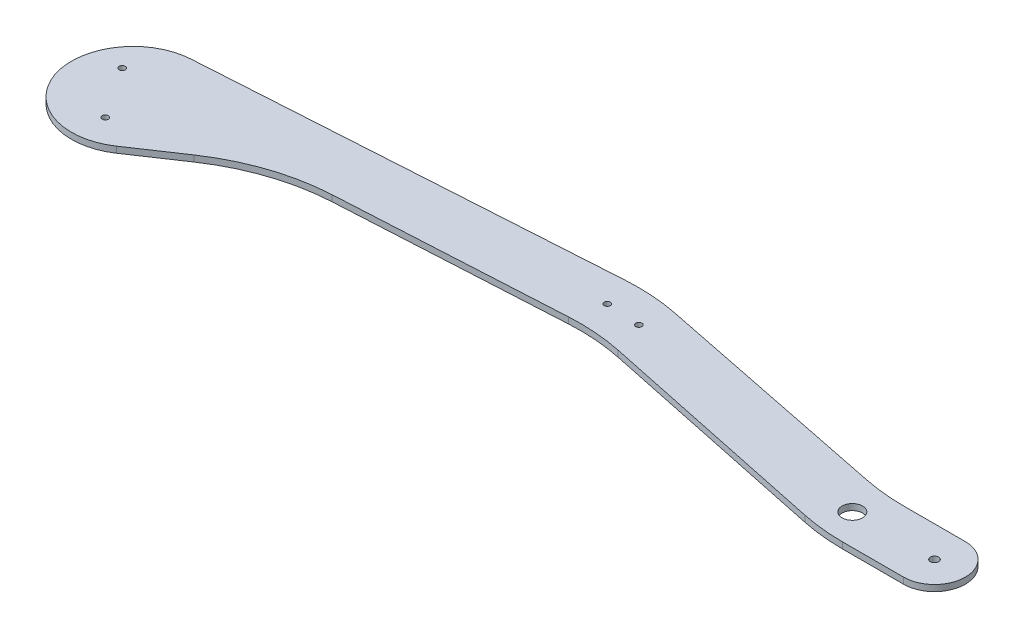
ISO-10303-21;
HEADER;
FILE_DESCRIPTION(('STEP AP214'),'2;1');
FILE_NAME('part.step','',(''),(''),'','','');
FILE_SCHEMA(('AUTOMOTIVE_DESIGN { 1 0 10303 214 1 1 1 1 }'));
ENDSEC;
DATA;
#1=APPLICATION_CONTEXT('core data for automotive mechanical design processes');
#2=APPLICATION_PROTOCOL_DEFINITION('international standard','automotive_design',2000,#1);
#3=PRODUCT_CONTEXT('',#1,'mechanical');
#4=PRODUCT('Part','Part','',(#3));
#5=PRODUCT_RELATED_PRODUCT_CATEGORY('part','',(#4));
#6=PRODUCT_DEFINITION_FORMATION('','',#4);
#7=PRODUCT_DEFINITION_CONTEXT('part definition',#1,'design');
#8=PRODUCT_DEFINITION('design','',#6,#7);
#9=PRODUCT_DEFINITION_SHAPE('','',#8);
#10=(LENGTH_UNIT() NAMED_UNIT(*) SI_UNIT(.MILLI.,.METRE.));
#11=(NAMED_UNIT(*) PLANE_ANGLE_UNIT() SI_UNIT($,.RADIAN.));
#12=(NAMED_UNIT(*) SI_UNIT($,.STERADIAN.) SOLID_ANGLE_UNIT());
#13=UNCERTAINTY_MEASURE_WITH_UNIT(LENGTH_MEASURE(1.E-05),#10,'distance_accuracy_value','');
#14=(GEOMETRIC_REPRESENTATION_CONTEXT(3) GLOBAL_UNCERTAINTY_ASSIGNED_CONTEXT((#13)) GLOBAL_UNIT_ASSIGNED_CONTEXT((#10,
#11,#12)) REPRESENTATION_CONTEXT('',''));
#15=CARTESIAN_POINT('',(0.,0.,0.));
#16=DIRECTION('',(0.,0.,1.));
#17=DIRECTION('',(1.,0.,0.));
#18=AXIS2_PLACEMENT_3D('',#15,#16,#17);
#19=CARTESIAN_POINT('',(-350.,-1.5,0.));
#20=DIRECTION('',(0.,1.,0.));
#21=DIRECTION('',(0.,0.,1.));
#22=AXIS2_PLACEMENT_3D('',#19,#20,#21);
#23=CYLINDRICAL_SURFACE('',#22,30.);
#24=DIRECTION('',(0.,1.,0.));
#25=VECTOR('',#24,1.);
#26=CARTESIAN_POINT('',(-333.28573951652,-1.5,24.9125168638253));
#27=LINE('',#26,#25);
#28=CARTESIAN_POINT('',(-333.28573951652,-1.5,24.9125168638253));
#29=VERTEX_POINT('',#28);
#30=CARTESIAN_POINT('',(-333.28573951652,1.5,24.9125168638253));
#31=VERTEX_POINT('',#30);
#32=EDGE_CURVE('E136',#29,#31,#27,.T.);
#33=ORIENTED_EDGE('',*,*,#32,.T.);
#34=CARTESIAN_POINT('',(-350.,1.5,0.));
#35=DIRECTION('',(0.,1.,0.));
#36=DIRECTION('',(0.,0.,1.));
#37=AXIS2_PLACEMENT_3D('',#34,#35,#36);
#38=CIRCLE('',#37,30.);
#39=CARTESIAN_POINT('',(-351.875417006676,1.5,-29.9413228006224));
#40=VERTEX_POINT('',#39);
#41=EDGE_CURVE('E140',#40,#31,#38,.T.);
#42=ORIENTED_EDGE('',*,*,#41,.F.);
#43=DIRECTION('',(0.,1.,0.));
#44=VECTOR('',#43,1.);
#45=CARTESIAN_POINT('',(-351.875417006676,-1.5,-29.9413228006224));
#46=LINE('',#45,#44);
#47=CARTESIAN_POINT('',(-351.875417006676,-1.5,-29.9413228006224));
#48=VERTEX_POINT('',#47);
#49=EDGE_CURVE('E215',#48,#40,#46,.T.);
#50=ORIENTED_EDGE('',*,*,#49,.F.);
#51=CARTESIAN_POINT('',(-350.,-1.5,0.));
#52=DIRECTION('',(0.,1.,0.));
#53=DIRECTION('',(0.,0.,1.));
#54=AXIS2_PLACEMENT_3D('',#51,#52,#53);
#55=CIRCLE('',#54,30.);
#56=EDGE_CURVE('E142',#48,#29,#55,.T.);
#57=ORIENTED_EDGE('',*,*,#56,.T.);
#58=EDGE_LOOP('',(#33,#42,#50,#57));
#59=FACE_BOUND('',#58,.T.);
#60=ADVANCED_FACE('F35',(#59),#23,.T.);
#61=CARTESIAN_POINT('',(-3.24321270903869,-1.5,-51.778392904997));
#62=DIRECTION('',(-0.0625139002225495,0.,-0.998044093354079));
#63=DIRECTION('',(-0.998044093354079,0.,0.0625139002225496));
#64=AXIS2_PLACEMENT_3D('',#61,#62,#63);
#65=PLANE('',#64);
#66=DIRECTION('',(-0.998044093354079,0.,0.0625139002225495));
#67=VECTOR('',#66,1.);
#68=CARTESIAN_POINT('',(-3.24321270903869,1.5,-51.778392904997));
#69=LINE('',#68,#67);
#70=CARTESIAN_POINT('',(-152.924441108368,1.5,-42.4028979347315));
#71=VERTEX_POINT('',#70);
#72=EDGE_CURVE('E160',#71,#40,#69,.T.);
#73=ORIENTED_EDGE('',*,*,#72,.F.);
#74=DIRECTION('',(0.,1.,0.));
#75=VECTOR('',#74,1.);
#76=CARTESIAN_POINT('',(-152.924441108368,-1.5,-42.4028979347315));
#77=LINE('',#76,#75);
#78=CARTESIAN_POINT('',(-152.924441108368,-1.5,-42.4028979347315));
#79=VERTEX_POINT('',#78);
#80=EDGE_CURVE('E245',#71,#79,#77,.F.);
#81=ORIENTED_EDGE('',*,*,#80,.T.);
#82=DIRECTION('',(-0.998044093354079,0.,0.0625139002225495));
#83=VECTOR('',#82,1.);
#84=CARTESIAN_POINT('',(-3.24321270903869,-1.5,-51.778392904997));
#85=LINE('',#84,#83);
#86=EDGE_CURVE('E208',#79,#48,#85,.T.);
#87=ORIENTED_EDGE('',*,*,#86,.T.);
#88=ORIENTED_EDGE('',*,*,#49,.T.);
#89=EDGE_LOOP('',(#73,#81,#87,#88));
#90=FACE_BOUND('',#89,.T.);
#91=ADVANCED_FACE('F278',(#90),#65,.T.);
#92=CARTESIAN_POINT('',(2.91019905832324,-1.5,-14.4123614952442));
#93=DIRECTION('',(0.197929028485096,0.,-0.980216353507197));
#94=DIRECTION('',(-0.980216353507197,0.,-0.197929028485096));
#95=AXIS2_PLACEMENT_3D('',#92,#93,#94);
#96=PLANE('',#95);
#97=DIRECTION('',(-0.980216353507197,0.,-0.197929028485096));
#98=VECTOR('',#97,1.);
#99=CARTESIAN_POINT('',(2.91019905832324,1.5,-14.4123614952442));
#100=LINE('',#99,#98);
#101=CARTESIAN_POINT('',(-9.79757945192511,1.5,-16.9783646492803));
#102=VERTEX_POINT('',#101);
#103=CARTESIAN_POINT('',(-126.880148237604,1.5,-40.6201239500433));
#104=VERTEX_POINT('',#103);
#105=EDGE_CURVE('E180',#102,#104,#100,.T.);
#106=ORIENTED_EDGE('',*,*,#105,.F.);
#107=DIRECTION('',(0.,1.,0.));
#108=VECTOR('',#107,1.);
#109=CARTESIAN_POINT('',(-9.7975794519251,-1.5,-16.9783646492803));
#110=LINE('',#109,#108);
#111=CARTESIAN_POINT('',(-9.79757945192511,-1.5,-16.9783646492803));
#112=VERTEX_POINT('',#111);
#113=EDGE_CURVE('E243',#102,#112,#110,.F.);
#114=ORIENTED_EDGE('',*,*,#113,.T.);
#115=DIRECTION('',(-0.980216353507197,0.,-0.197929028485096));
#116=VECTOR('',#115,1.);
#117=CARTESIAN_POINT('',(2.91019905832324,-1.5,-14.4123614952442));
#118=LINE('',#117,#116);
#119=CARTESIAN_POINT('',(-126.880148237604,-1.5,-40.6201239500433));
#120=VERTEX_POINT('',#119);
#121=EDGE_CURVE('E205',#112,#120,#118,.T.);
#122=ORIENTED_EDGE('',*,*,#121,.T.);
#123=DIRECTION('',(0.,1.,0.));
#124=VECTOR('',#123,1.);
#125=CARTESIAN_POINT('',(-126.880148237604,-1.5,-40.6201239500433));
#126=LINE('',#125,#124);
#127=EDGE_CURVE('E240',#120,#104,#126,.T.);
#128=ORIENTED_EDGE('',*,*,#127,.T.);
#129=EDGE_LOOP('',(#106,#114,#122,#128));
#130=FACE_BOUND('',#129,.T.);
#131=ADVANCED_FACE('F283',(#130),#96,.T.);
#132=CARTESIAN_POINT('',(0.,-1.5,-15.));
#133=DIRECTION('',(0.,0.,1.));
#134=DIRECTION('',(1.,0.,0.));
#135=AXIS2_PLACEMENT_3D('',#132,#133,#134);
#136=PLANE('',#135);
#137=DIRECTION('',(1.,0.,0.));
#138=VECTOR('',#137,1.);
#139=CARTESIAN_POINT('',(0.,-1.5,-15.));
#140=LINE('',#139,#138);
#141=CARTESIAN_POINT('',(9.99532339658448,-1.5,-15.));
#142=VERTEX_POINT('',#141);
#143=CARTESIAN_POINT('',(40.,-1.5,-15.));
#144=VERTEX_POINT('',#143);
#145=EDGE_CURVE('E203',#142,#144,#140,.T.);
#146=ORIENTED_EDGE('',*,*,#145,.F.);
#147=DIRECTION('',(0.,1.,0.));
#148=VECTOR('',#147,1.);
#149=CARTESIAN_POINT('',(9.99532339658448,-1.5,-15.));
#150=LINE('',#149,#148);
#151=CARTESIAN_POINT('',(9.99532339658448,1.5,-15.));
#152=VERTEX_POINT('',#151);
#153=EDGE_CURVE('E237',#142,#152,#150,.T.);
#154=ORIENTED_EDGE('',*,*,#153,.T.);
#155=DIRECTION('',(1.,0.,0.));
#156=VECTOR('',#155,1.);
#157=CARTESIAN_POINT('',(0.,1.5,-15.));
#158=LINE('',#157,#156);
#159=CARTESIAN_POINT('',(40.,1.5,-15.));
#160=VERTEX_POINT('',#159);
#161=EDGE_CURVE('E178',#152,#160,#158,.T.);
#162=ORIENTED_EDGE('',*,*,#161,.T.);
#163=DIRECTION('',(0.,1.,0.));
#164=VECTOR('',#163,1.);
#165=CARTESIAN_POINT('',(40.,-1.5,-15.));
#166=LINE('',#165,#164);
#167=EDGE_CURVE('E218',#144,#160,#166,.T.);
#168=ORIENTED_EDGE('',*,*,#167,.F.);
#169=EDGE_LOOP('',(#146,#154,#162,#168));
#170=FACE_BOUND('',#169,.T.);
#171=ADVANCED_FACE('F318',(#170),#136,.F.);
#172=CARTESIAN_POINT('',(40.,-1.5,0.));
#173=DIRECTION('',(0.,1.,0.));
#174=DIRECTION('',(0.,0.,1.));
#175=AXIS2_PLACEMENT_3D('',#172,#173,#174);
#176=CYLINDRICAL_SURFACE('',#175,15.);
#177=ORIENTED_EDGE('',*,*,#167,.T.);
#178=CARTESIAN_POINT('',(40.,1.5,0.));
#179=DIRECTION('',(0.,1.,0.));
#180=DIRECTION('',(0.,0.,1.));
#181=AXIS2_PLACEMENT_3D('',#178,#179,#180);
#182=CIRCLE('',#181,15.);
#183=CARTESIAN_POINT('',(40.,1.5,15.));
#184=VERTEX_POINT('',#183);
#185=EDGE_CURVE('E175',#184,#160,#182,.T.);
#186=ORIENTED_EDGE('',*,*,#185,.F.);
#187=DIRECTION('',(0.,1.,0.));
#188=VECTOR('',#187,1.);
#189=CARTESIAN_POINT('',(40.,-1.5,15.));
#190=LINE('',#189,#188);
#191=CARTESIAN_POINT('',(40.,-1.5,15.));
#192=VERTEX_POINT('',#191);
#193=EDGE_CURVE('E144',#192,#184,#190,.T.);
#194=ORIENTED_EDGE('',*,*,#193,.F.);
#195=CARTESIAN_POINT('',(40.,-1.5,0.));
#196=DIRECTION('',(0.,1.,0.));
#197=DIRECTION('',(0.,0.,1.));
#198=AXIS2_PLACEMENT_3D('',#195,#196,#197);
#199=CIRCLE('',#198,15.);
#200=EDGE_CURVE('E200',#192,#144,#199,.T.);
#201=ORIENTED_EDGE('',*,*,#200,.T.);
#202=EDGE_LOOP('',(#177,#186,#194,#201));
#203=FACE_BOUND('',#202,.T.);
#204=ADVANCED_FACE('F323',(#203),#176,.T.);
#205=CARTESIAN_POINT('',(0.,-1.5,15.));
#206=DIRECTION('',(0.,0.,1.));
#207=DIRECTION('',(1.,0.,0.));
#208=AXIS2_PLACEMENT_3D('',#205,#206,#207);
#209=PLANE('',#208);
#210=DIRECTION('',(1.,0.,0.));
#211=VECTOR('',#210,1.);
#212=CARTESIAN_POINT('',(0.,1.5,15.));
#213=LINE('',#212,#211);
#214=CARTESIAN_POINT('',(10.2526447189393,1.5,15.));
#215=VERTEX_POINT('',#214);
#216=EDGE_CURVE('E173',#215,#184,#213,.T.);
#217=ORIENTED_EDGE('',*,*,#216,.F.);
#218=DIRECTION('',(0.,1.,0.));
#219=VECTOR('',#218,1.);
#220=CARTESIAN_POINT('',(10.2526447189393,-1.5,15.));
#221=LINE('',#220,#219);
#222=CARTESIAN_POINT('',(10.2526447189393,-1.5,15.));
#223=VERTEX_POINT('',#222);
#224=EDGE_CURVE('E231',#215,#223,#221,.F.);
#225=ORIENTED_EDGE('',*,*,#224,.T.);
#226=DIRECTION('',(1.,0.,0.));
#227=VECTOR('',#226,1.);
#228=CARTESIAN_POINT('',(0.,-1.5,15.));
#229=LINE('',#228,#227);
#230=EDGE_CURVE('E198',#223,#192,#229,.T.);
#231=ORIENTED_EDGE('',*,*,#230,.T.);
#232=ORIENTED_EDGE('',*,*,#193,.T.);
#233=EDGE_LOOP('',(#217,#225,#231,#232));
#234=FACE_BOUND('',#233,.T.);
#235=ADVANCED_FACE('F333',(#234),#209,.T.);
#236=CARTESIAN_POINT('',(-3.01378585704881,-1.5,14.3910568491865));
#237=DIRECTION('',(-0.20497419413347,0.,0.978767377745772));
#238=DIRECTION('',(0.978767377745772,0.,0.20497419413347));
#239=AXIS2_PLACEMENT_3D('',#236,#237,#238);
#240=PLANE('',#239);
#241=DIRECTION('',(0.978767377745772,0.,0.20497419413347));
#242=VECTOR('',#241,1.);
#243=CARTESIAN_POINT('',(-3.01378585704881,-1.5,14.3910568491865));
#244=LINE('',#243,#242);
#245=CARTESIAN_POINT('',(-125.16756201185,-1.5,-11.1904780456087));
#246=VERTEX_POINT('',#245);
#247=CARTESIAN_POINT('',(-10.2447746944077,-1.5,12.8767377745772));
#248=VERTEX_POINT('',#247);
#249=EDGE_CURVE('E195',#246,#248,#244,.T.);
#250=ORIENTED_EDGE('',*,*,#249,.T.);
#251=DIRECTION('',(0.,1.,0.));
#252=VECTOR('',#251,1.);
#253=CARTESIAN_POINT('',(-10.2447746944077,-1.5,12.8767377745772));
#254=LINE('',#253,#252);
#255=CARTESIAN_POINT('',(-10.2447746944077,1.5,12.8767377745772));
#256=VERTEX_POINT('',#255);
#257=EDGE_CURVE('E224',#248,#256,#254,.T.);
#258=ORIENTED_EDGE('',*,*,#257,.T.);
#259=DIRECTION('',(0.978767377745772,0.,0.20497419413347));
#260=VECTOR('',#259,1.);
#261=CARTESIAN_POINT('',(-3.01378585704881,1.5,14.3910568491865));
#262=LINE('',#261,#260);
#263=CARTESIAN_POINT('',(-125.16756201185,1.5,-11.1904780456087));
#264=VERTEX_POINT('',#263);
#265=EDGE_CURVE('E171',#264,#256,#262,.T.);
#266=ORIENTED_EDGE('',*,*,#265,.F.);
#267=DIRECTION('',(0.,1.,0.));
#268=VECTOR('',#267,1.);
#269=CARTESIAN_POINT('',(-125.16756201185,-1.5,-11.1904780456087));
#270=LINE('',#269,#268);
#271=EDGE_CURVE('E217',#264,#246,#270,.F.);
#272=ORIENTED_EDGE('',*,*,#271,.T.);
#273=EDGE_LOOP('',(#250,#258,#266,#272));
#274=FACE_BOUND('',#273,.T.);
#275=ADVANCED_FACE('F330',(#274),#240,.T.);
#276=CARTESIAN_POINT('',(-1.19004921764275,-1.5,-21.4737935567704));
#277=DIRECTION('',(0.0553337702493512,0.,0.998467913290153));
#278=DIRECTION('',(0.998467913290153,0.,-0.0553337702493512));
#279=AXIS2_PLACEMENT_3D('',#276,#277,#278);
#280=PLANE('',#279);
#281=DIRECTION('',(0.998467913290153,0.,-0.0553337702493512));
#282=VECTOR('',#281,1.);
#283=CARTESIAN_POINT('',(-1.19004921764275,-1.5,-21.4737935567704));
#284=LINE('',#283,#282);
#285=CARTESIAN_POINT('',(-260.427572141376,-1.5,-7.1071931457422));
#286=VERTEX_POINT('',#285);
#287=CARTESIAN_POINT('',(-151.198358450132,-1.5,-13.1605316000468));
#288=VERTEX_POINT('',#287);
#289=EDGE_CURVE('E193',#286,#288,#284,.T.);
#290=ORIENTED_EDGE('',*,*,#289,.T.);
#291=DIRECTION('',(0.,1.,0.));
#292=VECTOR('',#291,1.);
#293=CARTESIAN_POINT('',(-151.198358450132,1.5,-13.1605316000468));
#294=LINE('',#293,#292);
#295=CARTESIAN_POINT('',(-151.198358450132,1.5,-13.1605316000468));
#296=VERTEX_POINT('',#295);
#297=EDGE_CURVE('E249',#288,#296,#294,.T.);
#298=ORIENTED_EDGE('',*,*,#297,.T.);
#299=DIRECTION('',(0.998467913290153,0.,-0.0553337702493512));
#300=VECTOR('',#299,1.);
#301=CARTESIAN_POINT('',(-1.19004921764275,1.5,-21.4737935567704));
#302=LINE('',#301,#300);
#303=CARTESIAN_POINT('',(-260.427572141376,1.5,-7.1071931457422));
#304=VERTEX_POINT('',#303);
#305=EDGE_CURVE('E154',#304,#296,#302,.T.);
#306=ORIENTED_EDGE('',*,*,#305,.F.);
#307=DIRECTION('',(0.,1.,0.));
#308=VECTOR('',#307,1.);
#309=CARTESIAN_POINT('',(-260.427572141376,-1.5,-7.10719314574221));
#310=LINE('',#309,#308);
#311=EDGE_CURVE('E247',#304,#286,#310,.F.);
#312=ORIENTED_EDGE('',*,*,#311,.T.);
#313=EDGE_LOOP('',(#290,#298,#306,#312));
#314=FACE_BOUND('',#313,.T.);
#315=ADVANCED_FACE('F263',(#314),#280,.T.);
#316=CARTESIAN_POINT('',(0.,-1.5,0.));
#317=DIRECTION('',(0.,1.,0.));
#318=DIRECTION('',(0.,0.,1.));
#319=AXIS2_PLACEMENT_3D('',#316,#317,#318);
#320=CYLINDRICAL_SURFACE('',#319,5.);
#321=CARTESIAN_POINT('',(0.,-1.5,0.));
#322=DIRECTION('',(0.,1.,0.));
#323=DIRECTION('',(0.,0.,1.));
#324=AXIS2_PLACEMENT_3D('',#321,#322,#323);
#325=CIRCLE('',#324,5.);
#326=CARTESIAN_POINT('',(0.,-1.5,5.));
#327=VERTEX_POINT('',#326);
#328=EDGE_CURVE('E210',#327,#327,#325,.T.);
#329=ORIENTED_EDGE('',*,*,#328,.F.);
#330=EDGE_LOOP('',(#329));
#331=FACE_BOUND('',#330,.T.);
#332=CARTESIAN_POINT('',(0.,1.5,0.));
#333=DIRECTION('',(0.,1.,0.));
#334=DIRECTION('',(0.,0.,1.));
#335=AXIS2_PLACEMENT_3D('',#332,#333,#334);
#336=CIRCLE('',#335,5.);
#337=CARTESIAN_POINT('',(0.,1.5,5.));
#338=VERTEX_POINT('',#337);
#339=EDGE_CURVE('E184',#338,#338,#336,.T.);
#340=ORIENTED_EDGE('',*,*,#339,.T.);
#341=EDGE_LOOP('',(#340));
#342=FACE_BOUND('',#341,.T.);
#343=ADVANCED_FACE('F344',(#331,#342),#320,.F.);
#344=CARTESIAN_POINT('',(-91.9282686591511,-1.5,-137.018598309922));
#345=DIRECTION('',(0.557142016116002,0.,0.830417228794174));
#346=DIRECTION('',(0.830417228794175,0.,-0.557142016116002));
#347=AXIS2_PLACEMENT_3D('',#344,#345,#346);
#348=PLANE('',#347);
#349=DIRECTION('',(0.830417228794175,0.,-0.557142016116002));
#350=VECTOR('',#349,1.);
#351=CARTESIAN_POINT('',(-91.9282686591511,-1.5,-137.018598309922));
#352=LINE('',#351,#350);
#353=CARTESIAN_POINT('',(-310.608396728041,-1.5,9.69787530385566));
#354=VERTEX_POINT('',#353);
#355=EDGE_CURVE('E191',#29,#354,#352,.T.);
#356=ORIENTED_EDGE('',*,*,#355,.T.);
#357=DIRECTION('',(0.,1.,0.));
#358=VECTOR('',#357,1.);
#359=CARTESIAN_POINT('',(-310.608396728041,1.5,9.69787530385566));
#360=LINE('',#359,#358);
#361=CARTESIAN_POINT('',(-310.608396728041,1.5,9.69787530385566));
#362=VERTEX_POINT('',#361);
#363=EDGE_CURVE('E152',#354,#362,#360,.T.);
#364=ORIENTED_EDGE('',*,*,#363,.T.);
#365=DIRECTION('',(0.830417228794175,0.,-0.557142016116002));
#366=VECTOR('',#365,1.);
#367=CARTESIAN_POINT('',(-91.9282686591511,1.5,-137.018598309922));
#368=LINE('',#367,#366);
#369=EDGE_CURVE('E149',#31,#362,#368,.T.);
#370=ORIENTED_EDGE('',*,*,#369,.F.);
#371=ORIENTED_EDGE('',*,*,#32,.F.);
#372=EDGE_LOOP('',(#356,#364,#370,#371));
#373=FACE_BOUND('',#372,.T.);
#374=ADVANCED_FACE('F150',(#373),#348,.T.);
#375=CARTESIAN_POINT('',(40.,-1.5,0.));
#376=DIRECTION('',(0.,1.,0.));
#377=DIRECTION('',(0.,0.,1.));
#378=AXIS2_PLACEMENT_3D('',#375,#376,#377);
#379=CYLINDRICAL_SURFACE('',#378,2.);
#380=CARTESIAN_POINT('',(40.,-1.5,0.));
#381=DIRECTION('',(0.,1.,0.));
#382=DIRECTION('',(0.,0.,1.));
#383=AXIS2_PLACEMENT_3D('',#380,#381,#382);
#384=CIRCLE('',#383,2.);
#385=CARTESIAN_POINT('',(40.,-1.5,2.));
#386=VERTEX_POINT('',#385);
#387=EDGE_CURVE('E145',#386,#386,#384,.T.);
#388=ORIENTED_EDGE('',*,*,#387,.F.);
#389=EDGE_LOOP('',(#388));
#390=FACE_BOUND('',#389,.T.);
#391=CARTESIAN_POINT('',(40.,1.5,0.));
#392=DIRECTION('',(0.,1.,0.));
#393=DIRECTION('',(0.,0.,1.));
#394=AXIS2_PLACEMENT_3D('',#391,#392,#393);
#395=CIRCLE('',#394,2.);
#396=CARTESIAN_POINT('',(40.,1.5,2.));
#397=VERTEX_POINT('',#396);
#398=EDGE_CURVE('E187',#397,#397,#395,.T.);
#399=ORIENTED_EDGE('',*,*,#398,.T.);
#400=EDGE_LOOP('',(#399));
#401=FACE_BOUND('',#400,.T.);
#402=ADVANCED_FACE('F353',(#390,#401),#379,.F.);
#403=CARTESIAN_POINT('',(0.,-1.5,0.));
#404=DIRECTION('',(0.,1.,0.));
#405=DIRECTION('',(0.,0.,1.));
#406=AXIS2_PLACEMENT_3D('',#403,#404,#405);
#407=PLANE('',#406);
#408=CARTESIAN_POINT('',(-348.032450788802,-1.5,15.4967432247671));
#409=DIRECTION('',(0.,1.,0.));
#410=DIRECTION('',(0.,0.,1.));
#411=AXIS2_PLACEMENT_3D('',#408,#409,#410);
#412=CIRCLE('',#411,1.50000000000002);
#413=CARTESIAN_POINT('',(-348.032450788802,-1.5,16.9967432247671));
#414=VERTEX_POINT('',#413);
#415=EDGE_CURVE('E162',#414,#414,#412,.T.);
#416=ORIENTED_EDGE('',*,*,#415,.T.);
#417=EDGE_LOOP('',(#416));
#418=FACE_BOUND('',#417,.T.);
#419=CARTESIAN_POINT('',(-364.746711272282,-1.5,-9.41577363905814));
#420=DIRECTION('',(0.,1.,0.));
#421=DIRECTION('',(0.,0.,1.));
#422=AXIS2_PLACEMENT_3D('',#419,#420,#421);
#423=CIRCLE('',#422,1.50000000000002);
#424=CARTESIAN_POINT('',(-364.746711272282,-1.5,-7.91577363905811));
#425=VERTEX_POINT('',#424);
#426=EDGE_CURVE('E165',#425,#425,#423,.T.);
#427=ORIENTED_EDGE('',*,*,#426,.T.);
#428=EDGE_LOOP('',(#427));
#429=FACE_BOUND('',#428,.T.);
#430=CARTESIAN_POINT('',(-130.791911052962,-1.5,-26.905656844259));
#431=DIRECTION('',(0.,1.,0.));
#432=DIRECTION('',(0.,0.,1.));
#433=AXIS2_PLACEMENT_3D('',#430,#431,#432);
#434=CIRCLE('',#433,1.50000000000002);
#435=CARTESIAN_POINT('',(-130.791911052962,-1.5,-25.4056568442589));
#436=VERTEX_POINT('',#435);
#437=EDGE_CURVE('E498',#436,#436,#434,.T.);
#438=ORIENTED_EDGE('',*,*,#437,.T.);
#439=EDGE_LOOP('',(#438));
#440=FACE_BOUND('',#439,.T.);
#441=CARTESIAN_POINT('',(-147.33624692302,-1.5,-28.0506034789789));
#442=DIRECTION('',(0.,1.,0.));
#443=DIRECTION('',(0.,0.,1.));
#444=AXIS2_PLACEMENT_3D('',#441,#442,#443);
#445=CIRCLE('',#444,1.5);
#446=CARTESIAN_POINT('',(-147.33624692302,-1.5,-26.5506034789789));
#447=VERTEX_POINT('',#446);
#448=EDGE_CURVE('E501',#447,#447,#445,.T.);
#449=ORIENTED_EDGE('',*,*,#448,.T.);
#450=EDGE_LOOP('',(#449));
#451=FACE_BOUND('',#450,.T.);
#452=ORIENTED_EDGE('',*,*,#230,.F.);
#453=CARTESIAN_POINT('',(10.2526447189393,-1.5,-85.));
#454=DIRECTION('',(0.,1.,0.));
#455=DIRECTION('',(0.,0.,1.));
#456=AXIS2_PLACEMENT_3D('',#453,#454,#455);
#457=CIRCLE('',#456,100.);
#458=EDGE_CURVE('E235',#223,#248,#457,.F.);
#459=ORIENTED_EDGE('',*,*,#458,.T.);
#460=ORIENTED_EDGE('',*,*,#249,.F.);
#461=CARTESIAN_POINT('',(-145.664981425197,-1.5,86.6862597289684));
#462=DIRECTION('',(0.,1.,0.));
#463=DIRECTION('',(0.,0.,1.));
#464=AXIS2_PLACEMENT_3D('',#461,#462,#463);
#465=CIRCLE('',#464,100.);
#466=EDGE_CURVE('E54',#246,#288,#465,.T.);
#467=ORIENTED_EDGE('',*,*,#466,.T.);
#468=ORIENTED_EDGE('',*,*,#289,.F.);
#469=CARTESIAN_POINT('',(-254.894195116441,-1.5,92.7395981832731));
#470=DIRECTION('',(0.,1.,0.));
#471=DIRECTION('',(0.,0.,1.));
#472=AXIS2_PLACEMENT_3D('',#469,#470,#471);
#473=CIRCLE('',#472,100.);
#474=EDGE_CURVE('E11',#286,#354,#473,.T.);
#475=ORIENTED_EDGE('',*,*,#474,.T.);
#476=ORIENTED_EDGE('',*,*,#355,.F.);
#477=ORIENTED_EDGE('',*,*,#56,.F.);
#478=ORIENTED_EDGE('',*,*,#86,.F.);
#479=CARTESIAN_POINT('',(-146.673051086113,-1.5,57.4015114006764));
#480=DIRECTION('',(0.,1.,0.));
#481=DIRECTION('',(0.,0.,1.));
#482=AXIS2_PLACEMENT_3D('',#479,#480,#481);
#483=CIRCLE('',#482,100.);
#484=EDGE_CURVE('E233',#79,#120,#483,.F.);
#485=ORIENTED_EDGE('',*,*,#484,.T.);
#486=ORIENTED_EDGE('',*,*,#121,.F.);
#487=CARTESIAN_POINT('',(9.99532339658448,-1.5,-115.));
#488=DIRECTION('',(0.,1.,0.));
#489=DIRECTION('',(0.,0.,1.));
#490=AXIS2_PLACEMENT_3D('',#487,#488,#489);
#491=CIRCLE('',#490,100.);
#492=EDGE_CURVE('E255',#112,#142,#491,.T.);
#493=ORIENTED_EDGE('',*,*,#492,.T.);
#494=ORIENTED_EDGE('',*,*,#145,.T.);
#495=ORIENTED_EDGE('',*,*,#200,.F.);
#496=EDGE_LOOP('',(#452,#459,#460,#467,#468,#475,#476,#477,#478,#485,#486,#493,#494,#495));
#497=FACE_BOUND('',#496,.T.);
#498=ORIENTED_EDGE('',*,*,#328,.T.);
#499=EDGE_LOOP('',(#498));
#500=FACE_BOUND('',#499,.T.);
#501=ORIENTED_EDGE('',*,*,#387,.T.);
#502=EDGE_LOOP('',(#501));
#503=FACE_BOUND('',#502,.T.);
#504=ADVANCED_FACE('F307',(#418,#429,#440,#451,#497,#500,#503),#407,.F.);
#505=CARTESIAN_POINT('',(0.,1.5,0.));
#506=DIRECTION('',(0.,1.,0.));
#507=DIRECTION('',(0.,0.,1.));
#508=AXIS2_PLACEMENT_3D('',#505,#506,#507);
#509=PLANE('',#508);
#510=CARTESIAN_POINT('',(-348.032450788802,1.5,15.4967432247671));
#511=DIRECTION('',(0.,1.,0.));
#512=DIRECTION('',(0.,0.,1.));
#513=AXIS2_PLACEMENT_3D('',#510,#511,#512);
#514=CIRCLE('',#513,1.50000000000002);
#515=CARTESIAN_POINT('',(-348.032450788802,1.5,16.9967432247671));
#516=VERTEX_POINT('',#515);
#517=EDGE_CURVE('E489',#516,#516,#514,.T.);
#518=ORIENTED_EDGE('',*,*,#517,.F.);
#519=EDGE_LOOP('',(#518));
#520=FACE_BOUND('',#519,.T.);
#521=CARTESIAN_POINT('',(-364.746711272282,1.5,-9.41577363905814));
#522=DIRECTION('',(0.,1.,0.));
#523=DIRECTION('',(0.,0.,1.));
#524=AXIS2_PLACEMENT_3D('',#521,#522,#523);
#525=CIRCLE('',#524,1.50000000000002);
#526=CARTESIAN_POINT('',(-364.746711272282,1.5,-7.91577363905811));
#527=VERTEX_POINT('',#526);
#528=EDGE_CURVE('E511',#527,#527,#525,.T.);
#529=ORIENTED_EDGE('',*,*,#528,.F.);
#530=EDGE_LOOP('',(#529));
#531=FACE_BOUND('',#530,.T.);
#532=CARTESIAN_POINT('',(-130.791911052962,1.5,-26.905656844259));
#533=DIRECTION('',(0.,1.,0.));
#534=DIRECTION('',(0.,0.,1.));
#535=AXIS2_PLACEMENT_3D('',#532,#533,#534);
#536=CIRCLE('',#535,1.50000000000002);
#537=CARTESIAN_POINT('',(-130.791911052962,1.5,-25.4056568442589));
#538=VERTEX_POINT('',#537);
#539=EDGE_CURVE('E507',#538,#538,#536,.T.);
#540=ORIENTED_EDGE('',*,*,#539,.F.);
#541=EDGE_LOOP('',(#540));
#542=FACE_BOUND('',#541,.T.);
#543=CARTESIAN_POINT('',(-147.33624692302,1.5,-28.0506034789789));
#544=DIRECTION('',(0.,1.,0.));
#545=DIRECTION('',(0.,0.,1.));
#546=AXIS2_PLACEMENT_3D('',#543,#544,#545);
#547=CIRCLE('',#546,1.5);
#548=CARTESIAN_POINT('',(-147.33624692302,1.5,-26.5506034789789));
#549=VERTEX_POINT('',#548);
#550=EDGE_CURVE('E503',#549,#549,#547,.T.);
#551=ORIENTED_EDGE('',*,*,#550,.F.);
#552=EDGE_LOOP('',(#551));
#553=FACE_BOUND('',#552,.T.);
#554=ORIENTED_EDGE('',*,*,#265,.T.);
#555=CARTESIAN_POINT('',(10.2526447189393,1.5,-85.));
#556=DIRECTION('',(0.,1.,0.));
#557=DIRECTION('',(0.,0.,1.));
#558=AXIS2_PLACEMENT_3D('',#555,#556,#557);
#559=CIRCLE('',#558,100.);
#560=EDGE_CURVE('E229',#256,#215,#559,.T.);
#561=ORIENTED_EDGE('',*,*,#560,.T.);
#562=ORIENTED_EDGE('',*,*,#216,.T.);
#563=ORIENTED_EDGE('',*,*,#185,.T.);
#564=ORIENTED_EDGE('',*,*,#161,.F.);
#565=CARTESIAN_POINT('',(9.99532339658448,1.5,-115.));
#566=DIRECTION('',(0.,1.,0.));
#567=DIRECTION('',(0.,0.,1.));
#568=AXIS2_PLACEMENT_3D('',#565,#566,#567);
#569=CIRCLE('',#568,100.);
#570=EDGE_CURVE('E253',#152,#102,#569,.F.);
#571=ORIENTED_EDGE('',*,*,#570,.T.);
#572=ORIENTED_EDGE('',*,*,#105,.T.);
#573=CARTESIAN_POINT('',(-146.673051086113,1.5,57.4015114006764));
#574=DIRECTION('',(0.,1.,0.));
#575=DIRECTION('',(0.,0.,1.));
#576=AXIS2_PLACEMENT_3D('',#573,#574,#575);
#577=CIRCLE('',#576,100.);
#578=EDGE_CURVE('E227',#104,#71,#577,.T.);
#579=ORIENTED_EDGE('',*,*,#578,.T.);
#580=ORIENTED_EDGE('',*,*,#72,.T.);
#581=ORIENTED_EDGE('',*,*,#41,.T.);
#582=ORIENTED_EDGE('',*,*,#369,.T.);
#583=CARTESIAN_POINT('',(-254.894195116441,1.5,92.7395981832731));
#584=DIRECTION('',(0.,1.,0.));
#585=DIRECTION('',(0.,0.,1.));
#586=AXIS2_PLACEMENT_3D('',#583,#584,#585);
#587=CIRCLE('',#586,100.);
#588=EDGE_CURVE('E43',#362,#304,#587,.F.);
#589=ORIENTED_EDGE('',*,*,#588,.T.);
#590=ORIENTED_EDGE('',*,*,#305,.T.);
#591=CARTESIAN_POINT('',(-145.664981425197,1.5,86.6862597289684));
#592=DIRECTION('',(0.,1.,0.));
#593=DIRECTION('',(0.,0.,1.));
#594=AXIS2_PLACEMENT_3D('',#591,#592,#593);
#595=CIRCLE('',#594,100.);
#596=EDGE_CURVE('E257',#296,#264,#595,.F.);
#597=ORIENTED_EDGE('',*,*,#596,.T.);
#598=EDGE_LOOP('',(#554,#561,#562,#563,#564,#571,#572,#579,#580,#581,#582,#589,#590,#597));
#599=FACE_BOUND('',#598,.T.);
#600=ORIENTED_EDGE('',*,*,#339,.F.);
#601=EDGE_LOOP('',(#600));
#602=FACE_BOUND('',#601,.T.);
#603=ORIENTED_EDGE('',*,*,#398,.F.);
#604=EDGE_LOOP('',(#603));
#605=FACE_BOUND('',#604,.T.);
#606=ADVANCED_FACE('F157',(#520,#531,#542,#553,#599,#602,#605),#509,.T.);
#607=CARTESIAN_POINT('',(10.2526447189393,-1.5,-85.));
#608=DIRECTION('',(0.,1.,0.));
#609=DIRECTION('',(0.,0.,1.));
#610=AXIS2_PLACEMENT_3D('',#607,#608,#609);
#611=CYLINDRICAL_SURFACE('',#610,100.);
#612=ORIENTED_EDGE('',*,*,#458,.F.);
#613=ORIENTED_EDGE('',*,*,#224,.F.);
#614=ORIENTED_EDGE('',*,*,#560,.F.);
#615=ORIENTED_EDGE('',*,*,#257,.F.);
#616=EDGE_LOOP('',(#612,#613,#614,#615));
#617=FACE_BOUND('',#616,.T.);
#618=ADVANCED_FACE('F289',(#617),#611,.T.);
#619=CARTESIAN_POINT('',(9.99532339658448,-1.5,-115.));
#620=DIRECTION('',(0.,1.,0.));
#621=DIRECTION('',(0.,0.,1.));
#622=AXIS2_PLACEMENT_3D('',#619,#620,#621);
#623=CYLINDRICAL_SURFACE('',#622,100.);
#624=ORIENTED_EDGE('',*,*,#492,.F.);
#625=ORIENTED_EDGE('',*,*,#113,.F.);
#626=ORIENTED_EDGE('',*,*,#570,.F.);
#627=ORIENTED_EDGE('',*,*,#153,.F.);
#628=EDGE_LOOP('',(#624,#625,#626,#627));
#629=FACE_BOUND('',#628,.T.);
#630=ADVANCED_FACE('F292',(#629),#623,.F.);
#631=CARTESIAN_POINT('',(-146.673051086113,-1.5,57.4015114006764));
#632=DIRECTION('',(0.,1.,0.));
#633=DIRECTION('',(0.,0.,1.));
#634=AXIS2_PLACEMENT_3D('',#631,#632,#633);
#635=CYLINDRICAL_SURFACE('',#634,100.);
#636=ORIENTED_EDGE('',*,*,#484,.F.);
#637=ORIENTED_EDGE('',*,*,#80,.F.);
#638=ORIENTED_EDGE('',*,*,#578,.F.);
#639=ORIENTED_EDGE('',*,*,#127,.F.);
#640=EDGE_LOOP('',(#636,#637,#638,#639));
#641=FACE_BOUND('',#640,.T.);
#642=ADVANCED_FACE('F275',(#641),#635,.T.);
#643=CARTESIAN_POINT('',(-145.664981425197,-1.5,86.6862597289684));
#644=DIRECTION('',(0.,-1.,0.));
#645=DIRECTION('',(0.,0.,-1.));
#646=AXIS2_PLACEMENT_3D('',#643,#644,#645);
#647=CYLINDRICAL_SURFACE('',#646,100.);
#648=ORIENTED_EDGE('',*,*,#466,.F.);
#649=ORIENTED_EDGE('',*,*,#271,.F.);
#650=ORIENTED_EDGE('',*,*,#596,.F.);
#651=ORIENTED_EDGE('',*,*,#297,.F.);
#652=EDGE_LOOP('',(#648,#649,#650,#651));
#653=FACE_BOUND('',#652,.T.);
#654=ADVANCED_FACE('F267',(#653),#647,.F.);
#655=CARTESIAN_POINT('',(-254.894195116441,-1.5,92.7395981832731));
#656=DIRECTION('',(0.,-1.,0.));
#657=DIRECTION('',(0.,0.,-1.));
#658=AXIS2_PLACEMENT_3D('',#655,#656,#657);
#659=CYLINDRICAL_SURFACE('',#658,100.);
#660=ORIENTED_EDGE('',*,*,#474,.F.);
#661=ORIENTED_EDGE('',*,*,#311,.F.);
#662=ORIENTED_EDGE('',*,*,#588,.F.);
#663=ORIENTED_EDGE('',*,*,#363,.F.);
#664=EDGE_LOOP('',(#660,#661,#662,#663));
#665=FACE_BOUND('',#664,.T.);
#666=ADVANCED_FACE('F37',(#665),#659,.F.);
#667=CARTESIAN_POINT('',(-147.33624692302,-8.5,-28.0506034789789));
#668=DIRECTION('',(0.,1.,0.));
#669=DIRECTION('',(0.,0.,1.));
#670=AXIS2_PLACEMENT_3D('',#667,#668,#669);
#671=CYLINDRICAL_SURFACE('',#670,1.5);
#672=ORIENTED_EDGE('',*,*,#550,.T.);
#673=EDGE_LOOP('',(#672));
#674=FACE_BOUND('',#673,.T.);
#675=ORIENTED_EDGE('',*,*,#448,.F.);
#676=EDGE_LOOP('',(#675));
#677=FACE_BOUND('',#676,.T.);
#678=ADVANCED_FACE('F266',(#674,#677),#671,.F.);
#679=CARTESIAN_POINT('',(-130.791911052962,-8.5,-26.905656844259));
#680=DIRECTION('',(0.,1.,0.));
#681=DIRECTION('',(0.,0.,1.));
#682=AXIS2_PLACEMENT_3D('',#679,#680,#681);
#683=CYLINDRICAL_SURFACE('',#682,1.50000000000002);
#684=ORIENTED_EDGE('',*,*,#539,.T.);
#685=EDGE_LOOP('',(#684));
#686=FACE_BOUND('',#685,.T.);
#687=ORIENTED_EDGE('',*,*,#437,.F.);
#688=EDGE_LOOP('',(#687));
#689=FACE_BOUND('',#688,.T.);
#690=ADVANCED_FACE('F272',(#686,#689),#683,.F.);
#691=CARTESIAN_POINT('',(-364.746711272282,-8.5,-9.41577363905814));
#692=DIRECTION('',(0.,1.,0.));
#693=DIRECTION('',(0.,0.,1.));
#694=AXIS2_PLACEMENT_3D('',#691,#692,#693);
#695=CYLINDRICAL_SURFACE('',#694,1.50000000000002);
#696=ORIENTED_EDGE('',*,*,#528,.T.);
#697=EDGE_LOOP('',(#696));
#698=FACE_BOUND('',#697,.T.);
#699=ORIENTED_EDGE('',*,*,#426,.F.);
#700=EDGE_LOOP('',(#699));
#701=FACE_BOUND('',#700,.T.);
#702=ADVANCED_FACE('F462',(#698,#701),#695,.F.);
#703=CARTESIAN_POINT('',(-348.032450788802,-8.5,15.4967432247671));
#704=DIRECTION('',(0.,1.,0.));
#705=DIRECTION('',(0.,0.,1.));
#706=AXIS2_PLACEMENT_3D('',#703,#704,#705);
#707=CYLINDRICAL_SURFACE('',#706,1.50000000000002);
#708=ORIENTED_EDGE('',*,*,#517,.T.);
#709=EDGE_LOOP('',(#708));
#710=FACE_BOUND('',#709,.T.);
#711=ORIENTED_EDGE('',*,*,#415,.F.);
#712=EDGE_LOOP('',(#711));
#713=FACE_BOUND('',#712,.T.);
#714=ADVANCED_FACE('F471',(#710,#713),#707,.F.);
#715=CLOSED_SHELL('',(#60,#91,#131,#171,#204,#235,#275,#315,#343,#374,#402,#504,#606,#618,#630,
#642,#654,#666,#678,#690,#702,#714));
#716=MANIFOLD_SOLID_BREP('B2',#715);
#717=ADVANCED_BREP_SHAPE_REPRESENTATION('',(#18,#716),#14);
#718=SHAPE_DEFINITION_REPRESENTATION(#9,#717);
ENDSEC;
END-ISO-10303-21;
